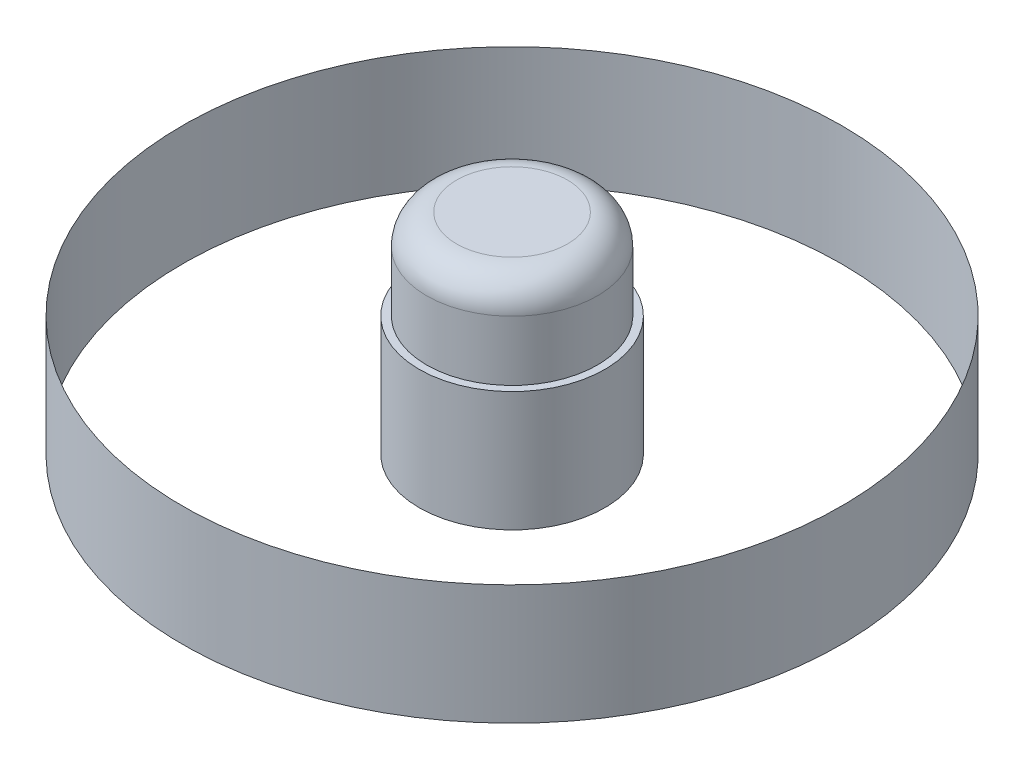
ISO-10303-21;
HEADER;
FILE_DESCRIPTION(('STEP AP214'),'2;1');
FILE_NAME('part.step','',(''),(''),'','','');
FILE_SCHEMA(('AUTOMOTIVE_DESIGN { 1 0 10303 214 1 1 1 1 }'));
ENDSEC;
DATA;
#1=APPLICATION_CONTEXT('core data for automotive mechanical design processes');
#2=APPLICATION_PROTOCOL_DEFINITION('international standard','automotive_design',2000,#1);
#3=PRODUCT_CONTEXT('',#1,'mechanical');
#4=PRODUCT('Part','Part','',(#3));
#5=PRODUCT_RELATED_PRODUCT_CATEGORY('part','',(#4));
#6=PRODUCT_DEFINITION_FORMATION('','',#4);
#7=PRODUCT_DEFINITION_CONTEXT('part definition',#1,'design');
#8=PRODUCT_DEFINITION('design','',#6,#7);
#9=PRODUCT_DEFINITION_SHAPE('','',#8);
#10=(LENGTH_UNIT() NAMED_UNIT(*) SI_UNIT(.MILLI.,.METRE.));
#11=(NAMED_UNIT(*) PLANE_ANGLE_UNIT() SI_UNIT($,.RADIAN.));
#12=(NAMED_UNIT(*) SI_UNIT($,.STERADIAN.) SOLID_ANGLE_UNIT());
#13=UNCERTAINTY_MEASURE_WITH_UNIT(LENGTH_MEASURE(1.E-05),#10,'distance_accuracy_value','');
#14=(GEOMETRIC_REPRESENTATION_CONTEXT(3) GLOBAL_UNCERTAINTY_ASSIGNED_CONTEXT((#13)) GLOBAL_UNIT_ASSIGNED_CONTEXT((#10,
#11,#12)) REPRESENTATION_CONTEXT('',''));
#15=CARTESIAN_POINT('',(0.,0.,0.));
#16=DIRECTION('',(0.,0.,1.));
#17=DIRECTION('',(1.,0.,0.));
#18=AXIS2_PLACEMENT_3D('',#15,#16,#17);
#19=CARTESIAN_POINT('',(0.,0.,0.));
#20=DIRECTION('',(0.,1.,0.));
#21=DIRECTION('',(0.,0.,1.));
#22=AXIS2_PLACEMENT_3D('',#19,#20,#21);
#23=CYLINDRICAL_SURFACE('',#22,110.);
#24=CARTESIAN_POINT('',(0.,0.,0.));
#25=DIRECTION('',(0.,-1.,0.));
#26=DIRECTION('',(0.,0.,-1.));
#27=AXIS2_PLACEMENT_3D('',#24,#25,#26);
#28=CIRCLE('',#27,110.);
#29=CARTESIAN_POINT('',(0.,0.,-110.));
#30=VERTEX_POINT('',#29);
#31=EDGE_CURVE('E51',#30,#30,#28,.T.);
#32=ORIENTED_EDGE('',*,*,#31,.T.);
#33=EDGE_LOOP('',(#32));
#34=FACE_BOUND('',#33,.T.);
#35=CARTESIAN_POINT('',(0.,40.,0.));
#36=DIRECTION('',(0.,-1.,0.));
#37=DIRECTION('',(0.,0.,-1.));
#38=AXIS2_PLACEMENT_3D('',#35,#36,#37);
#39=CIRCLE('',#38,110.);
#40=CARTESIAN_POINT('',(0.,40.,-110.));
#41=VERTEX_POINT('',#40);
#42=EDGE_CURVE('E11',#41,#41,#39,.T.);
#43=ORIENTED_EDGE('',*,*,#42,.F.);
#44=EDGE_LOOP('',(#43));
#45=FACE_BOUND('',#44,.T.);
#46=ADVANCED_FACE('F47',(#34,#45),#23,.F.);
#47=OPEN_SHELL('',(#46));
#48=SHELL_BASED_SURFACE_MODEL('B2',(#47));
#49=CARTESIAN_POINT('',(0.,40.,0.));
#50=DIRECTION('',(0.,-1.,0.));
#51=DIRECTION('',(0.,0.,-1.));
#52=AXIS2_PLACEMENT_3D('',#49,#50,#51);
#53=CYLINDRICAL_SURFACE('',#52,31.);
#54=CARTESIAN_POINT('',(0.,40.,0.));
#55=DIRECTION('',(0.,1.,0.));
#56=DIRECTION('',(0.,0.,1.));
#57=AXIS2_PLACEMENT_3D('',#54,#55,#56);
#58=CIRCLE('',#57,31.);
#59=CARTESIAN_POINT('',(0.,40.,31.));
#60=VERTEX_POINT('',#59);
#61=EDGE_CURVE('E90',#60,#60,#58,.T.);
#62=ORIENTED_EDGE('',*,*,#61,.F.);
#63=EDGE_LOOP('',(#62));
#64=FACE_BOUND('',#63,.T.);
#65=CARTESIAN_POINT('',(0.,0.,0.));
#66=DIRECTION('',(0.,1.,0.));
#67=DIRECTION('',(0.,0.,1.));
#68=AXIS2_PLACEMENT_3D('',#65,#66,#67);
#69=CIRCLE('',#68,31.);
#70=CARTESIAN_POINT('',(0.,0.,31.));
#71=VERTEX_POINT('',#70);
#72=EDGE_CURVE('E93',#71,#71,#69,.T.);
#73=ORIENTED_EDGE('',*,*,#72,.T.);
#74=EDGE_LOOP('',(#73));
#75=FACE_BOUND('',#74,.T.);
#76=ADVANCED_FACE('F72',(#64,#75),#53,.T.);
#77=CARTESIAN_POINT('',(0.,40.,0.));
#78=DIRECTION('',(0.,1.,0.));
#79=DIRECTION('',(0.,0.,1.));
#80=AXIS2_PLACEMENT_3D('',#77,#78,#79);
#81=PLANE('',#80);
#82=CARTESIAN_POINT('',(0.,40.,0.));
#83=DIRECTION('',(0.,1.,0.));
#84=DIRECTION('',(0.,0.,1.));
#85=AXIS2_PLACEMENT_3D('',#82,#83,#84);
#86=CIRCLE('',#85,28.5);
#87=CARTESIAN_POINT('',(0.,40.,28.5));
#88=VERTEX_POINT('',#87);
#89=EDGE_CURVE('E85',#88,#88,#86,.T.);
#90=ORIENTED_EDGE('',*,*,#89,.F.);
#91=EDGE_LOOP('',(#90));
#92=FACE_BOUND('',#91,.T.);
#93=ORIENTED_EDGE('',*,*,#61,.T.);
#94=EDGE_LOOP('',(#93));
#95=FACE_BOUND('',#94,.T.);
#96=ADVANCED_FACE('F138',(#92,#95),#81,.T.);
#97=CARTESIAN_POINT('',(0.,0.,0.));
#98=DIRECTION('',(0.,1.,0.));
#99=DIRECTION('',(0.,0.,1.));
#100=AXIS2_PLACEMENT_3D('',#97,#98,#99);
#101=PLANE('',#100);
#102=CARTESIAN_POINT('',(0.,0.,0.));
#103=DIRECTION('',(0.,1.,0.));
#104=DIRECTION('',(0.,0.,1.));
#105=AXIS2_PLACEMENT_3D('',#102,#103,#104);
#106=CIRCLE('',#105,28.);
#107=CARTESIAN_POINT('',(0.,0.,28.));
#108=VERTEX_POINT('',#107);
#109=EDGE_CURVE('E101',#108,#108,#106,.T.);
#110=ORIENTED_EDGE('',*,*,#109,.T.);
#111=EDGE_LOOP('',(#110));
#112=FACE_BOUND('',#111,.T.);
#113=ORIENTED_EDGE('',*,*,#72,.F.);
#114=EDGE_LOOP('',(#113));
#115=FACE_BOUND('',#114,.T.);
#116=ADVANCED_FACE('F143',(#112,#115),#101,.F.);
#117=CARTESIAN_POINT('',(0.,70.,0.));
#118=DIRECTION('',(0.,-1.,0.));
#119=DIRECTION('',(0.,0.,-1.));
#120=AXIS2_PLACEMENT_3D('',#117,#118,#119);
#121=CYLINDRICAL_SURFACE('',#120,28.5);
#122=CARTESIAN_POINT('',(0.,60.,0.));
#123=DIRECTION('',(0.,1.,0.));
#124=DIRECTION('',(0.,0.,1.));
#125=AXIS2_PLACEMENT_3D('',#122,#123,#124);
#126=CIRCLE('',#125,28.5);
#127=CARTESIAN_POINT('',(0.,60.,28.5));
#128=VERTEX_POINT('',#127);
#129=EDGE_CURVE('E46',#128,#128,#126,.F.);
#130=ORIENTED_EDGE('',*,*,#129,.T.);
#131=EDGE_LOOP('',(#130));
#132=FACE_BOUND('',#131,.T.);
#133=ORIENTED_EDGE('',*,*,#89,.T.);
#134=EDGE_LOOP('',(#133));
#135=FACE_BOUND('',#134,.T.);
#136=ADVANCED_FACE('F150',(#132,#135),#121,.T.);
#137=CARTESIAN_POINT('',(0.,70.,0.));
#138=DIRECTION('',(0.,1.,0.));
#139=DIRECTION('',(0.,0.,1.));
#140=AXIS2_PLACEMENT_3D('',#137,#138,#139);
#141=PLANE('',#140);
#142=CARTESIAN_POINT('',(0.,70.,0.));
#143=DIRECTION('',(0.,1.,0.));
#144=DIRECTION('',(0.,0.,1.));
#145=AXIS2_PLACEMENT_3D('',#142,#143,#144);
#146=CIRCLE('',#145,18.5);
#147=CARTESIAN_POINT('',(0.,70.,18.5));
#148=VERTEX_POINT('',#147);
#149=EDGE_CURVE('E80',#148,#148,#146,.T.);
#150=ORIENTED_EDGE('',*,*,#149,.T.);
#151=EDGE_LOOP('',(#150));
#152=FACE_BOUND('',#151,.T.);
#153=ADVANCED_FACE('F155',(#152),#141,.T.);
#154=CARTESIAN_POINT('',(0.,60.,0.));
#155=DIRECTION('',(0.,1.,0.));
#156=DIRECTION('',(0.,0.,1.));
#157=AXIS2_PLACEMENT_3D('',#154,#155,#156);
#158=TOROIDAL_SURFACE('',#157,18.5,10.);
#159=ORIENTED_EDGE('',*,*,#129,.F.);
#160=EDGE_LOOP('',(#159));
#161=FACE_BOUND('',#160,.T.);
#162=ORIENTED_EDGE('',*,*,#149,.F.);
#163=EDGE_LOOP('',(#162));
#164=FACE_BOUND('',#163,.T.);
#165=ADVANCED_FACE('F74',(#161,#164),#158,.T.);
#166=CARTESIAN_POINT('',(0.,40.,0.));
#167=DIRECTION('',(0.,-1.,0.));
#168=DIRECTION('',(0.,0.,-1.));
#169=AXIS2_PLACEMENT_3D('',#166,#167,#168);
#170=CYLINDRICAL_SURFACE('',#169,28.);
#171=CARTESIAN_POINT('',(0.,37.,0.));
#172=DIRECTION('',(0.,1.,0.));
#173=DIRECTION('',(0.,0.,1.));
#174=AXIS2_PLACEMENT_3D('',#171,#172,#173);
#175=CIRCLE('',#174,28.);
#176=CARTESIAN_POINT('',(0.,37.,28.));
#177=VERTEX_POINT('',#176);
#178=EDGE_CURVE('E105',#177,#177,#175,.T.);
#179=ORIENTED_EDGE('',*,*,#178,.T.);
#180=EDGE_LOOP('',(#179));
#181=FACE_BOUND('',#180,.T.);
#182=ORIENTED_EDGE('',*,*,#109,.F.);
#183=EDGE_LOOP('',(#182));
#184=FACE_BOUND('',#183,.T.);
#185=ADVANCED_FACE('F121',(#181,#184),#170,.F.);
#186=CARTESIAN_POINT('',(0.,37.,0.));
#187=DIRECTION('',(0.,1.,0.));
#188=DIRECTION('',(0.,0.,1.));
#189=AXIS2_PLACEMENT_3D('',#186,#187,#188);
#190=PLANE('',#189);
#191=CARTESIAN_POINT('',(0.,37.,0.));
#192=DIRECTION('',(0.,1.,0.));
#193=DIRECTION('',(0.,0.,1.));
#194=AXIS2_PLACEMENT_3D('',#191,#192,#193);
#195=CIRCLE('',#194,25.5);
#196=CARTESIAN_POINT('',(0.,37.,25.5));
#197=VERTEX_POINT('',#196);
#198=EDGE_CURVE('E110',#197,#197,#195,.T.);
#199=ORIENTED_EDGE('',*,*,#198,.T.);
#200=EDGE_LOOP('',(#199));
#201=FACE_BOUND('',#200,.T.);
#202=ORIENTED_EDGE('',*,*,#178,.F.);
#203=EDGE_LOOP('',(#202));
#204=FACE_BOUND('',#203,.T.);
#205=ADVANCED_FACE('F124',(#201,#204),#190,.F.);
#206=CARTESIAN_POINT('',(0.,70.,0.));
#207=DIRECTION('',(0.,-1.,0.));
#208=DIRECTION('',(0.,0.,-1.));
#209=AXIS2_PLACEMENT_3D('',#206,#207,#208);
#210=CYLINDRICAL_SURFACE('',#209,25.5);
#211=CARTESIAN_POINT('',(0.,60.,0.));
#212=DIRECTION('',(0.,-1.,0.));
#213=DIRECTION('',(0.,0.,-1.));
#214=AXIS2_PLACEMENT_3D('',#211,#212,#213);
#215=CIRCLE('',#214,25.5);
#216=CARTESIAN_POINT('',(0.,60.,-25.5));
#217=VERTEX_POINT('',#216);
#218=EDGE_CURVE('E97',#217,#217,#215,.T.);
#219=ORIENTED_EDGE('',*,*,#218,.F.);
#220=EDGE_LOOP('',(#219));
#221=FACE_BOUND('',#220,.T.);
#222=ORIENTED_EDGE('',*,*,#198,.F.);
#223=EDGE_LOOP('',(#222));
#224=FACE_BOUND('',#223,.T.);
#225=ADVANCED_FACE('F126',(#221,#224),#210,.F.);
#226=CARTESIAN_POINT('',(0.,67.,0.));
#227=DIRECTION('',(0.,1.,0.));
#228=DIRECTION('',(0.,0.,1.));
#229=AXIS2_PLACEMENT_3D('',#226,#227,#228);
#230=PLANE('',#229);
#231=CARTESIAN_POINT('',(0.,67.,0.));
#232=DIRECTION('',(0.,1.,0.));
#233=DIRECTION('',(0.,0.,1.));
#234=AXIS2_PLACEMENT_3D('',#231,#232,#233);
#235=CIRCLE('',#234,18.5);
#236=CARTESIAN_POINT('',(0.,67.,18.5));
#237=VERTEX_POINT('',#236);
#238=EDGE_CURVE('E106',#237,#237,#235,.T.);
#239=ORIENTED_EDGE('',*,*,#238,.F.);
#240=EDGE_LOOP('',(#239));
#241=FACE_BOUND('',#240,.T.);
#242=ADVANCED_FACE('F133',(#241),#230,.F.);
#243=CARTESIAN_POINT('',(0.,60.,0.));
#244=DIRECTION('',(0.,1.,0.));
#245=DIRECTION('',(0.,0.,1.));
#246=AXIS2_PLACEMENT_3D('',#243,#244,#245);
#247=TOROIDAL_SURFACE('',#246,18.5,7.);
#248=ORIENTED_EDGE('',*,*,#218,.T.);
#249=EDGE_LOOP('',(#248));
#250=FACE_BOUND('',#249,.T.);
#251=ORIENTED_EDGE('',*,*,#238,.T.);
#252=EDGE_LOOP('',(#251));
#253=FACE_BOUND('',#252,.T.);
#254=ADVANCED_FACE('F158',(#250,#253),#247,.F.);
#255=CLOSED_SHELL('',(#76,#96,#116,#136,#153,#165,#185,#205,#225,#242,#254));
#256=MANIFOLD_SOLID_BREP('B6',#255);
#257=ADVANCED_BREP_SHAPE_REPRESENTATION('',(#18,#256),#14);
#258=MANIFOLD_SURFACE_SHAPE_REPRESENTATION('',(#18,#48),#14);
#259=SHAPE_REPRESENTATION('',(#18),#14);
#260=SHAPE_DEFINITION_REPRESENTATION(#9,#259);
#261=SHAPE_REPRESENTATION_RELATIONSHIP('','',#259,#257);
#262=SHAPE_REPRESENTATION_RELATIONSHIP('','',#259,#258);
ENDSEC;
END-ISO-10303-21;
